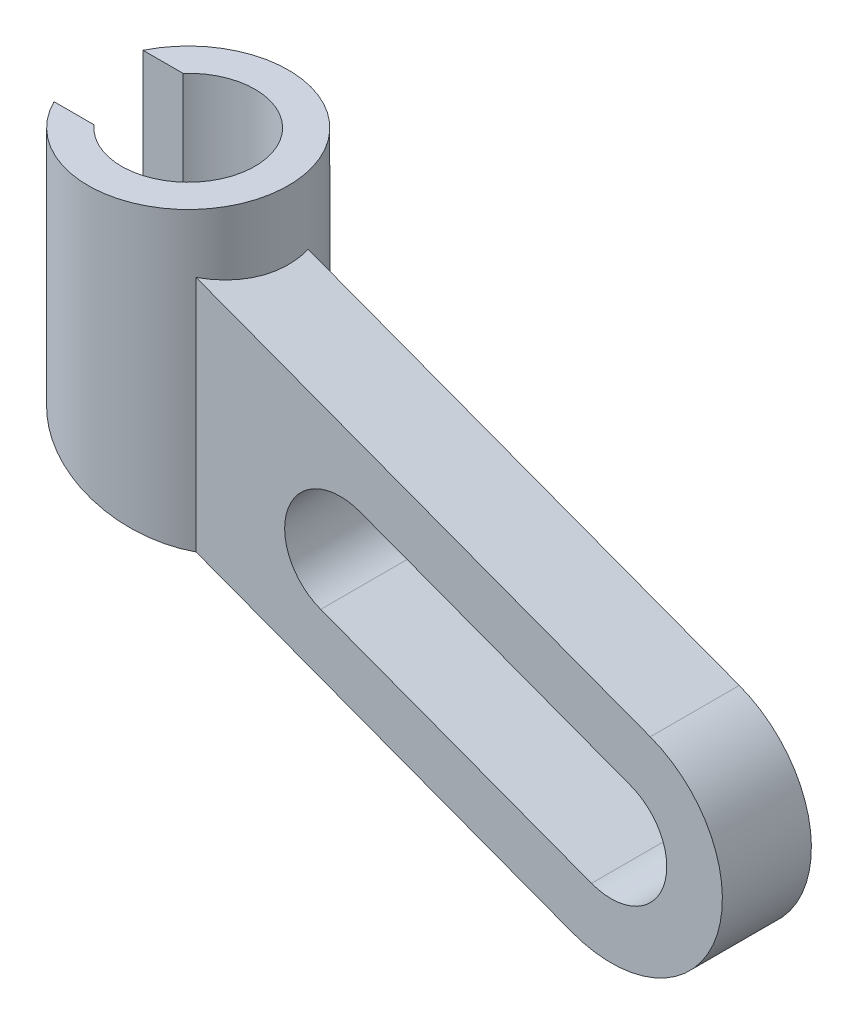
ISO-10303-21;
HEADER;
FILE_DESCRIPTION(('STEP AP214'),'2;1');
FILE_NAME('part.step','',(''),(''),'','','');
FILE_SCHEMA(('AUTOMOTIVE_DESIGN { 1 0 10303 214 1 1 1 1 }'));
ENDSEC;
DATA;
#1=APPLICATION_CONTEXT('core data for automotive mechanical design processes');
#2=APPLICATION_PROTOCOL_DEFINITION('international standard','automotive_design',2000,#1);
#3=PRODUCT_CONTEXT('',#1,'mechanical');
#4=PRODUCT('Part','Part','',(#3));
#5=PRODUCT_RELATED_PRODUCT_CATEGORY('part','',(#4));
#6=PRODUCT_DEFINITION_FORMATION('','',#4);
#7=PRODUCT_DEFINITION_CONTEXT('part definition',#1,'design');
#8=PRODUCT_DEFINITION('design','',#6,#7);
#9=PRODUCT_DEFINITION_SHAPE('','',#8);
#10=(LENGTH_UNIT() NAMED_UNIT(*) SI_UNIT(.MILLI.,.METRE.));
#11=(NAMED_UNIT(*) PLANE_ANGLE_UNIT() SI_UNIT($,.RADIAN.));
#12=(NAMED_UNIT(*) SI_UNIT($,.STERADIAN.) SOLID_ANGLE_UNIT());
#13=UNCERTAINTY_MEASURE_WITH_UNIT(LENGTH_MEASURE(1.E-05),#10,'distance_accuracy_value','');
#14=(GEOMETRIC_REPRESENTATION_CONTEXT(3) GLOBAL_UNCERTAINTY_ASSIGNED_CONTEXT((#13)) GLOBAL_UNIT_ASSIGNED_CONTEXT((#10,
#11,#12)) REPRESENTATION_CONTEXT('',''));
#15=CARTESIAN_POINT('',(0.,0.,0.));
#16=DIRECTION('',(0.,0.,1.));
#17=DIRECTION('',(1.,0.,0.));
#18=AXIS2_PLACEMENT_3D('',#15,#16,#17);
#19=CARTESIAN_POINT('',(0.,20.,0.));
#20=DIRECTION('',(0.,-1.,0.));
#21=DIRECTION('',(0.,0.,-1.));
#22=AXIS2_PLACEMENT_3D('',#19,#20,#21);
#23=CYLINDRICAL_SURFACE('',#22,4.5);
#24=DIRECTION('',(0.,-1.,0.));
#25=VECTOR('',#24,1.);
#26=CARTESIAN_POINT('',(-4.03112887414927,20.,-2.));
#27=LINE('',#26,#25);
#28=CARTESIAN_POINT('',(-4.03112887414928,20.,-2.));
#29=VERTEX_POINT('',#28);
#30=CARTESIAN_POINT('',(-4.03112887414927,9.44565665936147,-2.));
#31=VERTEX_POINT('',#30);
#32=EDGE_CURVE('E209',#29,#31,#27,.T.);
#33=ORIENTED_EDGE('',*,*,#32,.F.);
#34=CARTESIAN_POINT('',(0.,20.,0.));
#35=DIRECTION('',(0.,1.,0.));
#36=DIRECTION('',(0.,0.,1.));
#37=AXIS2_PLACEMENT_3D('',#34,#35,#36);
#38=CIRCLE('',#37,4.5);
#39=CARTESIAN_POINT('',(-4.03112887414927,20.,2.));
#40=VERTEX_POINT('',#39);
#41=EDGE_CURVE('E139',#40,#29,#38,.T.);
#42=ORIENTED_EDGE('',*,*,#41,.F.);
#43=DIRECTION('',(0.,-1.,0.));
#44=VECTOR('',#43,1.);
#45=CARTESIAN_POINT('',(-4.03112887414927,20.,2.));
#46=LINE('',#45,#44);
#47=CARTESIAN_POINT('',(-4.03112887414927,9.44565665936147,2.));
#48=VERTEX_POINT('',#47);
#49=EDGE_CURVE('E57',#48,#40,#46,.F.);
#50=ORIENTED_EDGE('',*,*,#49,.F.);
#51=CARTESIAN_POINT('',(0.,7.93,0.));
#52=DIRECTION('',(-0.351934204155188,-0.936024741096973,0.));
#53=DIRECTION('',(0.936024741096973,-0.351934204155188,0.));
#54=AXIS2_PLACEMENT_3D('',#51,#52,#53);
#55=ELLIPSE('',#54,4.80756523030175,4.5);
#56=CARTESIAN_POINT('',(3.35410196624968,6.66889743046317,3.));
#57=VERTEX_POINT('',#56);
#58=EDGE_CURVE('E140',#57,#48,#55,.T.);
#59=ORIENTED_EDGE('',*,*,#58,.F.);
#60=DIRECTION('',(0.,-1.,0.));
#61=VECTOR('',#60,1.);
#62=CARTESIAN_POINT('',(3.35410196624968,20.,3.));
#63=LINE('',#62,#61);
#64=CARTESIAN_POINT('',(3.35410196624968,17.3523757200226,3.));
#65=VERTEX_POINT('',#64);
#66=EDGE_CURVE('E128',#65,#57,#63,.T.);
#67=ORIENTED_EDGE('',*,*,#66,.F.);
#68=CARTESIAN_POINT('',(0.,18.6134782895594,0.));
#69=DIRECTION('',(0.351934204155188,0.936024741096973,0.));
#70=DIRECTION('',(0.936024741096973,-0.351934204155188,0.));
#71=AXIS2_PLACEMENT_3D('',#68,#69,#70);
#72=ELLIPSE('',#71,4.80756523030175,4.5);
#73=CARTESIAN_POINT('',(4.38748219369606,16.9638370073494,-1.));
#74=VERTEX_POINT('',#73);
#75=EDGE_CURVE('E142',#74,#65,#72,.F.);
#76=ORIENTED_EDGE('',*,*,#75,.F.);
#77=DIRECTION('',(0.,-1.,0.));
#78=VECTOR('',#77,1.);
#79=CARTESIAN_POINT('',(4.38748219369606,20.,-1.));
#80=LINE('',#79,#78);
#81=CARTESIAN_POINT('',(4.38748219369606,6.28035871779001,-1.));
#82=VERTEX_POINT('',#81);
#83=EDGE_CURVE('E151',#74,#82,#80,.T.);
#84=ORIENTED_EDGE('',*,*,#83,.T.);
#85=EDGE_CURVE('E145',#31,#82,#55,.T.);
#86=ORIENTED_EDGE('',*,*,#85,.F.);
#87=EDGE_LOOP('',(#33,#42,#50,#59,#67,#76,#84,#86));
#88=FACE_BOUND('',#87,.T.);
#89=ADVANCED_FACE('F35',(#88),#23,.T.);
#90=CARTESIAN_POINT('',(0.,20.,0.));
#91=DIRECTION('',(0.,-1.,0.));
#92=DIRECTION('',(0.,0.,-1.));
#93=AXIS2_PLACEMENT_3D('',#90,#91,#92);
#94=CYLINDRICAL_SURFACE('',#93,3.);
#95=CARTESIAN_POINT('',(0.,20.,0.));
#96=DIRECTION('',(0.,1.,0.));
#97=DIRECTION('',(0.,0.,1.));
#98=AXIS2_PLACEMENT_3D('',#95,#96,#97);
#99=CIRCLE('',#98,3.);
#100=CARTESIAN_POINT('',(-2.23606797749979,20.,2.));
#101=VERTEX_POINT('',#100);
#102=CARTESIAN_POINT('',(-2.23606797749979,20.,-2.));
#103=VERTEX_POINT('',#102);
#104=EDGE_CURVE('E133',#101,#103,#99,.T.);
#105=ORIENTED_EDGE('',*,*,#104,.T.);
#106=DIRECTION('',(0.,-1.,0.));
#107=VECTOR('',#106,1.);
#108=CARTESIAN_POINT('',(-2.23606797749979,20.,-2.));
#109=LINE('',#108,#107);
#110=CARTESIAN_POINT('',(-2.23606797749979,8.77073504635788,-2.));
#111=VERTEX_POINT('',#110);
#112=EDGE_CURVE('E50',#103,#111,#109,.T.);
#113=ORIENTED_EDGE('',*,*,#112,.T.);
#114=CARTESIAN_POINT('',(0.,7.93,0.));
#115=DIRECTION('',(-0.351934204155188,-0.936024741096973,0.));
#116=DIRECTION('',(0.936024741096973,-0.351934204155188,0.));
#117=AXIS2_PLACEMENT_3D('',#114,#115,#116);
#118=ELLIPSE('',#117,3.20504348686783,3.);
#119=CARTESIAN_POINT('',(-2.23606797749979,8.77073504635788,2.));
#120=VERTEX_POINT('',#119);
#121=EDGE_CURVE('E135',#111,#120,#118,.T.);
#122=ORIENTED_EDGE('',*,*,#121,.T.);
#123=DIRECTION('',(0.,-1.,0.));
#124=VECTOR('',#123,1.);
#125=CARTESIAN_POINT('',(-2.23606797749979,20.,2.));
#126=LINE('',#125,#124);
#127=EDGE_CURVE('E122',#120,#101,#126,.F.);
#128=ORIENTED_EDGE('',*,*,#127,.T.);
#129=EDGE_LOOP('',(#105,#113,#122,#128));
#130=FACE_BOUND('',#129,.T.);
#131=ADVANCED_FACE('F132',(#130),#94,.F.);
#132=CARTESIAN_POINT('',(20.2403289792241,0.319876294515138,-1.));
#133=DIRECTION('',(-0.351934204155188,-0.936024741096973,0.));
#134=DIRECTION('',(0.936024741096973,-0.351934204155188,0.));
#135=AXIS2_PLACEMENT_3D('',#132,#133,#134);
#136=PLANE('',#135);
#137=ORIENTED_EDGE('',*,*,#121,.F.);
#138=DIRECTION('',(-0.936024741096973,0.351934204155188,0.));
#139=VECTOR('',#138,1.);
#140=CARTESIAN_POINT('',(20.2403289792241,0.319876294515138,-2.));
#141=LINE('',#140,#139);
#142=EDGE_CURVE('E212',#111,#31,#141,.T.);
#143=ORIENTED_EDGE('',*,*,#142,.T.);
#144=ORIENTED_EDGE('',*,*,#85,.T.);
#145=DIRECTION('',(0.936024741096973,-0.351934204155188,0.));
#146=VECTOR('',#145,1.);
#147=CARTESIAN_POINT('',(20.2403289792241,0.319876294515138,-1.));
#148=LINE('',#147,#146);
#149=CARTESIAN_POINT('',(20.2403289792241,0.319876294515142,-1.));
#150=VERTEX_POINT('',#149);
#151=EDGE_CURVE('E189',#82,#150,#148,.T.);
#152=ORIENTED_EDGE('',*,*,#151,.T.);
#153=DIRECTION('',(0.,0.,1.));
#154=VECTOR('',#153,1.);
#155=CARTESIAN_POINT('',(20.2403289792241,0.319876294515142,-1.));
#156=LINE('',#155,#154);
#157=CARTESIAN_POINT('',(20.2403289792241,0.319876294515142,3.));
#158=VERTEX_POINT('',#157);
#159=EDGE_CURVE('E202',#150,#158,#156,.T.);
#160=ORIENTED_EDGE('',*,*,#159,.T.);
#161=DIRECTION('',(0.936024741096973,-0.351934204155188,0.));
#162=VECTOR('',#161,1.);
#163=CARTESIAN_POINT('',(20.2403289792241,0.319876294515138,3.));
#164=LINE('',#163,#162);
#165=EDGE_CURVE('E166',#57,#158,#164,.T.);
#166=ORIENTED_EDGE('',*,*,#165,.F.);
#167=ORIENTED_EDGE('',*,*,#58,.T.);
#168=DIRECTION('',(0.936024741096973,-0.351934204155188,0.));
#169=VECTOR('',#168,1.);
#170=CARTESIAN_POINT('',(20.2403289792241,0.319876294515138,2.));
#171=LINE('',#170,#169);
#172=EDGE_CURVE('E136',#48,#120,#171,.T.);
#173=ORIENTED_EDGE('',*,*,#172,.T.);
#174=EDGE_LOOP('',(#137,#143,#144,#152,#160,#166,#167,#173));
#175=FACE_BOUND('',#174,.T.);
#176=ADVANCED_FACE('F37',(#175),#136,.T.);
#177=CARTESIAN_POINT('',(0.,20.,0.));
#178=DIRECTION('',(0.,1.,0.));
#179=DIRECTION('',(0.,0.,1.));
#180=AXIS2_PLACEMENT_3D('',#177,#178,#179);
#181=PLANE('',#180);
#182=ORIENTED_EDGE('',*,*,#41,.T.);
#183=DIRECTION('',(1.,0.,0.));
#184=VECTOR('',#183,1.);
#185=CARTESIAN_POINT('',(0.,20.,-2.));
#186=LINE('',#185,#184);
#187=EDGE_CURVE('E11',#29,#103,#186,.T.);
#188=ORIENTED_EDGE('',*,*,#187,.T.);
#189=ORIENTED_EDGE('',*,*,#104,.F.);
#190=DIRECTION('',(-1.,0.,0.));
#191=VECTOR('',#190,1.);
#192=CARTESIAN_POINT('',(0.,20.,2.));
#193=LINE('',#192,#191);
#194=EDGE_CURVE('E43',#101,#40,#193,.T.);
#195=ORIENTED_EDGE('',*,*,#194,.T.);
#196=EDGE_LOOP('',(#182,#188,#189,#195));
#197=FACE_BOUND('',#196,.T.);
#198=ADVANCED_FACE('F138',(#197),#181,.T.);
#199=CARTESIAN_POINT('',(22.,5.,-1.));
#200=DIRECTION('',(0.,0.,1.));
#201=DIRECTION('',(1.,0.,0.));
#202=AXIS2_PLACEMENT_3D('',#199,#200,#201);
#203=PLANE('',#202);
#204=DIRECTION('',(0.936024741096973,-0.351934204155188,0.));
#205=VECTOR('',#204,1.);
#206=CARTESIAN_POINT('',(8.95184285535139,7.23508280127501,-1.));
#207=LINE('',#206,#205);
#208=CARTESIAN_POINT('',(8.95184285535139,7.23508280127501,-1.));
#209=VERTEX_POINT('',#208);
#210=CARTESIAN_POINT('',(21.120164489612,2.65993814725757,-1.));
#211=VERTEX_POINT('',#210);
#212=EDGE_CURVE('E183',#209,#211,#207,.T.);
#213=ORIENTED_EDGE('',*,*,#212,.T.);
#214=CARTESIAN_POINT('',(22.,5.,-1.));
#215=DIRECTION('',(0.,0.,1.));
#216=DIRECTION('',(1.,0.,0.));
#217=AXIS2_PLACEMENT_3D('',#214,#215,#216);
#218=CIRCLE('',#217,2.5);
#219=CARTESIAN_POINT('',(22.879835510388,7.34006185274243,-1.));
#220=VERTEX_POINT('',#219);
#221=EDGE_CURVE('E174',#211,#220,#218,.T.);
#222=ORIENTED_EDGE('',*,*,#221,.T.);
#223=DIRECTION('',(-0.936024741096973,0.351934204155187,0.));
#224=VECTOR('',#223,1.);
#225=CARTESIAN_POINT('',(22.879835510388,7.34006185274243,-1.));
#226=LINE('',#225,#224);
#227=CARTESIAN_POINT('',(10.7115138761273,11.9152065067599,-1.));
#228=VERTEX_POINT('',#227);
#229=EDGE_CURVE('E177',#220,#228,#226,.T.);
#230=ORIENTED_EDGE('',*,*,#229,.T.);
#231=CARTESIAN_POINT('',(9.83167836573935,9.57514465401744,-1.));
#232=DIRECTION('',(0.,0.,1.));
#233=DIRECTION('',(1.,0.,0.));
#234=AXIS2_PLACEMENT_3D('',#231,#232,#233);
#235=CIRCLE('',#234,2.49999999999999);
#236=EDGE_CURVE('E180',#228,#209,#235,.T.);
#237=ORIENTED_EDGE('',*,*,#236,.T.);
#238=EDGE_LOOP('',(#213,#222,#230,#237));
#239=FACE_BOUND('',#238,.T.);
#240=ORIENTED_EDGE('',*,*,#83,.F.);
#241=DIRECTION('',(-0.936024741096973,0.351934204155188,0.));
#242=VECTOR('',#241,1.);
#243=CARTESIAN_POINT('',(23.7596710207759,9.68012370548486,-1.));
#244=LINE('',#243,#242);
#245=CARTESIAN_POINT('',(23.7596710207759,9.68012370548486,-1.));
#246=VERTEX_POINT('',#245);
#247=EDGE_CURVE('E199',#246,#74,#244,.T.);
#248=ORIENTED_EDGE('',*,*,#247,.F.);
#249=CARTESIAN_POINT('',(22.,5.,-1.));
#250=DIRECTION('',(0.,0.,1.));
#251=DIRECTION('',(1.,0.,0.));
#252=AXIS2_PLACEMENT_3D('',#249,#250,#251);
#253=CIRCLE('',#252,5.);
#254=EDGE_CURVE('E196',#150,#246,#253,.T.);
#255=ORIENTED_EDGE('',*,*,#254,.F.);
#256=ORIENTED_EDGE('',*,*,#151,.F.);
#257=EDGE_LOOP('',(#240,#248,#255,#256));
#258=FACE_BOUND('',#257,.T.);
#259=ADVANCED_FACE('F244',(#239,#258),#203,.F.);
#260=CARTESIAN_POINT('',(22.,5.,3.));
#261=DIRECTION('',(0.,0.,1.));
#262=DIRECTION('',(1.,0.,0.));
#263=AXIS2_PLACEMENT_3D('',#260,#261,#262);
#264=PLANE('',#263);
#265=DIRECTION('',(-0.936024741096973,0.351934204155187,0.));
#266=VECTOR('',#265,1.);
#267=CARTESIAN_POINT('',(22.879835510388,7.34006185274243,3.));
#268=LINE('',#267,#266);
#269=CARTESIAN_POINT('',(22.879835510388,7.34006185274243,3.));
#270=VERTEX_POINT('',#269);
#271=CARTESIAN_POINT('',(10.7115138761273,11.9152065067599,3.));
#272=VERTEX_POINT('',#271);
#273=EDGE_CURVE('E157',#270,#272,#268,.T.);
#274=ORIENTED_EDGE('',*,*,#273,.F.);
#275=CARTESIAN_POINT('',(22.,5.,3.));
#276=DIRECTION('',(0.,0.,1.));
#277=DIRECTION('',(1.,0.,0.));
#278=AXIS2_PLACEMENT_3D('',#275,#276,#277);
#279=CIRCLE('',#278,2.5);
#280=CARTESIAN_POINT('',(21.120164489612,2.65993814725757,3.));
#281=VERTEX_POINT('',#280);
#282=EDGE_CURVE('E154',#281,#270,#279,.T.);
#283=ORIENTED_EDGE('',*,*,#282,.F.);
#284=DIRECTION('',(0.936024741096973,-0.351934204155188,0.));
#285=VECTOR('',#284,1.);
#286=CARTESIAN_POINT('',(8.95184285535139,7.23508280127501,3.));
#287=LINE('',#286,#285);
#288=CARTESIAN_POINT('',(8.95184285535139,7.23508280127501,3.));
#289=VERTEX_POINT('',#288);
#290=EDGE_CURVE('E163',#289,#281,#287,.T.);
#291=ORIENTED_EDGE('',*,*,#290,.F.);
#292=CARTESIAN_POINT('',(9.83167836573935,9.57514465401744,3.));
#293=DIRECTION('',(0.,0.,1.));
#294=DIRECTION('',(1.,0.,0.));
#295=AXIS2_PLACEMENT_3D('',#292,#293,#294);
#296=CIRCLE('',#295,2.49999999999999);
#297=EDGE_CURVE('E160',#272,#289,#296,.T.);
#298=ORIENTED_EDGE('',*,*,#297,.F.);
#299=EDGE_LOOP('',(#274,#283,#291,#298));
#300=FACE_BOUND('',#299,.T.);
#301=DIRECTION('',(-0.936024741096973,0.351934204155188,0.));
#302=VECTOR('',#301,1.);
#303=CARTESIAN_POINT('',(23.7596710207759,9.68012370548486,3.));
#304=LINE('',#303,#302);
#305=CARTESIAN_POINT('',(23.7596710207759,9.68012370548486,3.));
#306=VERTEX_POINT('',#305);
#307=EDGE_CURVE('E171',#306,#65,#304,.T.);
#308=ORIENTED_EDGE('',*,*,#307,.T.);
#309=ORIENTED_EDGE('',*,*,#66,.T.);
#310=ORIENTED_EDGE('',*,*,#165,.T.);
#311=CARTESIAN_POINT('',(22.,5.,3.));
#312=DIRECTION('',(0.,0.,1.));
#313=DIRECTION('',(1.,0.,0.));
#314=AXIS2_PLACEMENT_3D('',#311,#312,#313);
#315=CIRCLE('',#314,5.);
#316=EDGE_CURVE('E168',#158,#306,#315,.T.);
#317=ORIENTED_EDGE('',*,*,#316,.T.);
#318=EDGE_LOOP('',(#308,#309,#310,#317));
#319=FACE_BOUND('',#318,.T.);
#320=ADVANCED_FACE('F240',(#300,#319),#264,.T.);
#321=CARTESIAN_POINT('',(23.7596710207759,9.68012370548486,-1.));
#322=DIRECTION('',(0.351934204155188,0.936024741096973,0.));
#323=DIRECTION('',(-0.936024741096973,0.351934204155188,0.));
#324=AXIS2_PLACEMENT_3D('',#321,#322,#323);
#325=PLANE('',#324);
#326=ORIENTED_EDGE('',*,*,#247,.T.);
#327=ORIENTED_EDGE('',*,*,#75,.T.);
#328=ORIENTED_EDGE('',*,*,#307,.F.);
#329=DIRECTION('',(0.,0.,1.));
#330=VECTOR('',#329,1.);
#331=CARTESIAN_POINT('',(23.7596710207759,9.68012370548486,-1.));
#332=LINE('',#331,#330);
#333=EDGE_CURVE('E203',#246,#306,#332,.T.);
#334=ORIENTED_EDGE('',*,*,#333,.F.);
#335=EDGE_LOOP('',(#326,#327,#328,#334));
#336=FACE_BOUND('',#335,.T.);
#337=ADVANCED_FACE('F243',(#336),#325,.T.);
#338=CARTESIAN_POINT('',(22.,5.,-1.));
#339=DIRECTION('',(0.,0.,1.));
#340=DIRECTION('',(1.,0.,0.));
#341=AXIS2_PLACEMENT_3D('',#338,#339,#340);
#342=CYLINDRICAL_SURFACE('',#341,5.);
#343=ORIENTED_EDGE('',*,*,#333,.T.);
#344=ORIENTED_EDGE('',*,*,#316,.F.);
#345=ORIENTED_EDGE('',*,*,#159,.F.);
#346=ORIENTED_EDGE('',*,*,#254,.T.);
#347=EDGE_LOOP('',(#343,#344,#345,#346));
#348=FACE_BOUND('',#347,.T.);
#349=ADVANCED_FACE('F260',(#348),#342,.T.);
#350=CARTESIAN_POINT('',(22.,5.,-1.));
#351=DIRECTION('',(0.,0.,1.));
#352=DIRECTION('',(1.,0.,0.));
#353=AXIS2_PLACEMENT_3D('',#350,#351,#352);
#354=CYLINDRICAL_SURFACE('',#353,2.5);
#355=DIRECTION('',(0.,0.,1.));
#356=VECTOR('',#355,1.);
#357=CARTESIAN_POINT('',(21.120164489612,2.65993814725757,-1.));
#358=LINE('',#357,#356);
#359=EDGE_CURVE('E187',#211,#281,#358,.T.);
#360=ORIENTED_EDGE('',*,*,#359,.T.);
#361=ORIENTED_EDGE('',*,*,#282,.T.);
#362=DIRECTION('',(0.,0.,1.));
#363=VECTOR('',#362,1.);
#364=CARTESIAN_POINT('',(22.879835510388,7.34006185274243,-1.));
#365=LINE('',#364,#363);
#366=EDGE_CURVE('E186',#220,#270,#365,.T.);
#367=ORIENTED_EDGE('',*,*,#366,.F.);
#368=ORIENTED_EDGE('',*,*,#221,.F.);
#369=EDGE_LOOP('',(#360,#361,#367,#368));
#370=FACE_BOUND('',#369,.T.);
#371=ADVANCED_FACE('F250',(#370),#354,.F.);
#372=CARTESIAN_POINT('',(8.95184285535139,7.23508280127501,-1.));
#373=DIRECTION('',(-0.351934204155188,-0.936024741096973,0.));
#374=DIRECTION('',(0.936024741096973,-0.351934204155188,0.));
#375=AXIS2_PLACEMENT_3D('',#372,#373,#374);
#376=PLANE('',#375);
#377=DIRECTION('',(0.,0.,1.));
#378=VECTOR('',#377,1.);
#379=CARTESIAN_POINT('',(8.95184285535139,7.23508280127501,-1.));
#380=LINE('',#379,#378);
#381=EDGE_CURVE('E190',#209,#289,#380,.T.);
#382=ORIENTED_EDGE('',*,*,#381,.T.);
#383=ORIENTED_EDGE('',*,*,#290,.T.);
#384=ORIENTED_EDGE('',*,*,#359,.F.);
#385=ORIENTED_EDGE('',*,*,#212,.F.);
#386=EDGE_LOOP('',(#382,#383,#384,#385));
#387=FACE_BOUND('',#386,.T.);
#388=ADVANCED_FACE('F246',(#387),#376,.F.);
#389=CARTESIAN_POINT('',(9.83167836573935,9.57514465401744,-1.));
#390=DIRECTION('',(0.,0.,1.));
#391=DIRECTION('',(1.,0.,0.));
#392=AXIS2_PLACEMENT_3D('',#389,#390,#391);
#393=CYLINDRICAL_SURFACE('',#392,2.49999999999999);
#394=DIRECTION('',(0.,0.,1.));
#395=VECTOR('',#394,1.);
#396=CARTESIAN_POINT('',(10.7115138761273,11.9152065067599,-1.));
#397=LINE('',#396,#395);
#398=EDGE_CURVE('E192',#228,#272,#397,.T.);
#399=ORIENTED_EDGE('',*,*,#398,.T.);
#400=ORIENTED_EDGE('',*,*,#297,.T.);
#401=ORIENTED_EDGE('',*,*,#381,.F.);
#402=ORIENTED_EDGE('',*,*,#236,.F.);
#403=EDGE_LOOP('',(#399,#400,#401,#402));
#404=FACE_BOUND('',#403,.T.);
#405=ADVANCED_FACE('F249',(#404),#393,.F.);
#406=CARTESIAN_POINT('',(22.879835510388,7.34006185274243,-1.));
#407=DIRECTION('',(0.351934204155187,0.936024741096973,0.));
#408=DIRECTION('',(-0.936024741096973,0.351934204155187,0.));
#409=AXIS2_PLACEMENT_3D('',#406,#407,#408);
#410=PLANE('',#409);
#411=ORIENTED_EDGE('',*,*,#366,.T.);
#412=ORIENTED_EDGE('',*,*,#273,.T.);
#413=ORIENTED_EDGE('',*,*,#398,.F.);
#414=ORIENTED_EDGE('',*,*,#229,.F.);
#415=EDGE_LOOP('',(#411,#412,#413,#414));
#416=FACE_BOUND('',#415,.T.);
#417=ADVANCED_FACE('F230',(#416),#410,.F.);
#418=CARTESIAN_POINT('',(-14.8213808368058,20.,2.));
#419=DIRECTION('',(0.,0.,-1.));
#420=DIRECTION('',(-1.,0.,0.));
#421=AXIS2_PLACEMENT_3D('',#418,#419,#420);
#422=PLANE('',#421);
#423=ORIENTED_EDGE('',*,*,#49,.T.);
#424=ORIENTED_EDGE('',*,*,#194,.F.);
#425=ORIENTED_EDGE('',*,*,#127,.F.);
#426=ORIENTED_EDGE('',*,*,#172,.F.);
#427=EDGE_LOOP('',(#423,#424,#425,#426));
#428=FACE_BOUND('',#427,.T.);
#429=ADVANCED_FACE('F121',(#428),#422,.T.);
#430=CARTESIAN_POINT('',(-14.8213808368058,20.,-2.));
#431=DIRECTION('',(0.,0.,1.));
#432=DIRECTION('',(1.,0.,0.));
#433=AXIS2_PLACEMENT_3D('',#430,#431,#432);
#434=PLANE('',#433);
#435=ORIENTED_EDGE('',*,*,#32,.T.);
#436=ORIENTED_EDGE('',*,*,#142,.F.);
#437=ORIENTED_EDGE('',*,*,#112,.F.);
#438=ORIENTED_EDGE('',*,*,#187,.F.);
#439=EDGE_LOOP('',(#435,#436,#437,#438));
#440=FACE_BOUND('',#439,.T.);
#441=ADVANCED_FACE('F224',(#440),#434,.T.);
#442=CLOSED_SHELL('',(#89,#131,#176,#198,#259,#320,#337,#349,#371,#388,#405,#417,#429,#441));
#443=MANIFOLD_SOLID_BREP('B2',#442);
#444=ADVANCED_BREP_SHAPE_REPRESENTATION('',(#18,#443),#14);
#445=SHAPE_DEFINITION_REPRESENTATION(#9,#444);
ENDSEC;
END-ISO-10303-21;
